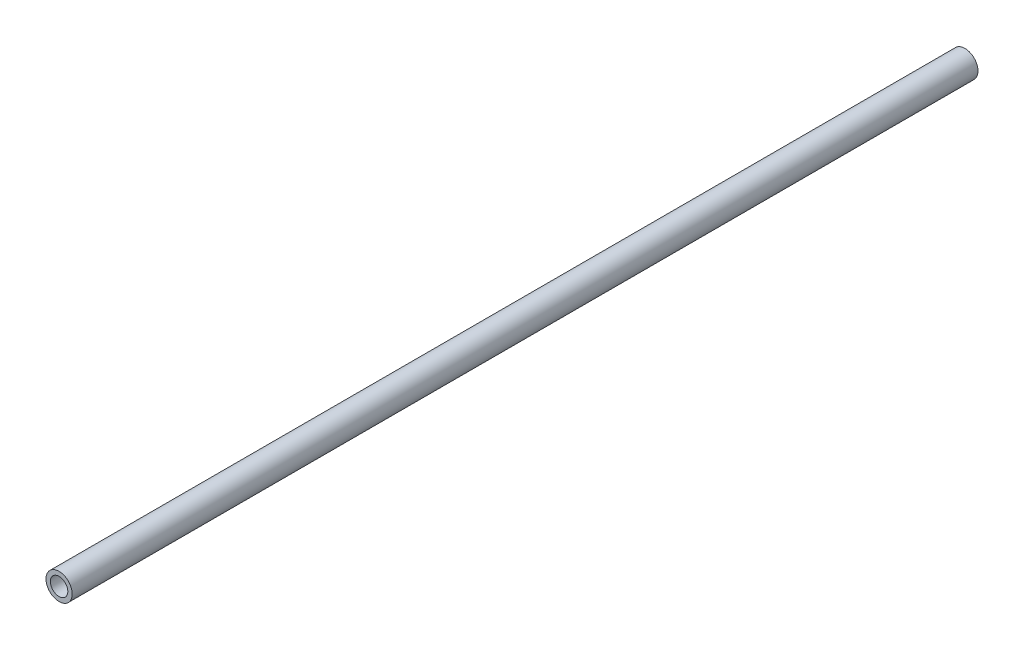
ISO-10303-21;
HEADER;
FILE_DESCRIPTION(('STEP AP214'),'2;1');
FILE_NAME('part.step','',(''),(''),'','','');
FILE_SCHEMA(('AUTOMOTIVE_DESIGN { 1 0 10303 214 1 1 1 1 }'));
ENDSEC;
DATA;
#1=APPLICATION_CONTEXT('core data for automotive mechanical design processes');
#2=APPLICATION_PROTOCOL_DEFINITION('international standard','automotive_design',2000,#1);
#3=PRODUCT_CONTEXT('',#1,'mechanical');
#4=PRODUCT('Part','Part','',(#3));
#5=PRODUCT_RELATED_PRODUCT_CATEGORY('part','',(#4));
#6=PRODUCT_DEFINITION_FORMATION('','',#4);
#7=PRODUCT_DEFINITION_CONTEXT('part definition',#1,'design');
#8=PRODUCT_DEFINITION('design','',#6,#7);
#9=PRODUCT_DEFINITION_SHAPE('','',#8);
#10=(LENGTH_UNIT() NAMED_UNIT(*) SI_UNIT(.MILLI.,.METRE.));
#11=(NAMED_UNIT(*) PLANE_ANGLE_UNIT() SI_UNIT($,.RADIAN.));
#12=(NAMED_UNIT(*) SI_UNIT($,.STERADIAN.) SOLID_ANGLE_UNIT());
#13=UNCERTAINTY_MEASURE_WITH_UNIT(LENGTH_MEASURE(1.E-05),#10,'distance_accuracy_value','');
#14=(GEOMETRIC_REPRESENTATION_CONTEXT(3) GLOBAL_UNCERTAINTY_ASSIGNED_CONTEXT((#13)) GLOBAL_UNIT_ASSIGNED_CONTEXT((#10,
#11,#12)) REPRESENTATION_CONTEXT('',''));
#15=CARTESIAN_POINT('',(0.,0.,0.));
#16=DIRECTION('',(0.,0.,1.));
#17=DIRECTION('',(1.,0.,0.));
#18=AXIS2_PLACEMENT_3D('',#15,#16,#17);
#19=CARTESIAN_POINT('',(0.,0.,207.5));
#20=DIRECTION('',(0.,0.,-1.));
#21=DIRECTION('',(-1.,0.,0.));
#22=AXIS2_PLACEMENT_3D('',#19,#20,#21);
#23=CYLINDRICAL_SURFACE('',#22,2.);
#24=CARTESIAN_POINT('',(0.,0.,207.5));
#25=DIRECTION('',(0.,0.,-1.));
#26=DIRECTION('',(1.,0.,0.));
#27=AXIS2_PLACEMENT_3D('',#24,#25,#26);
#28=CIRCLE('',#27,2.);
#29=CARTESIAN_POINT('',(2.,0.,207.5));
#30=VERTEX_POINT('',#29);
#31=EDGE_CURVE('E9',#30,#30,#28,.T.);
#32=ORIENTED_EDGE('',*,*,#31,.F.);
#33=EDGE_LOOP('',(#32));
#34=FACE_BOUND('',#33,.T.);
#35=CARTESIAN_POINT('',(0.,0.,0.));
#36=DIRECTION('',(0.,0.,-1.));
#37=DIRECTION('',(1.,0.,0.));
#38=AXIS2_PLACEMENT_3D('',#35,#36,#37);
#39=CIRCLE('',#38,2.);
#40=CARTESIAN_POINT('',(2.,0.,0.));
#41=VERTEX_POINT('',#40);
#42=EDGE_CURVE('E18',#41,#41,#39,.T.);
#43=ORIENTED_EDGE('',*,*,#42,.T.);
#44=EDGE_LOOP('',(#43));
#45=FACE_BOUND('',#44,.T.);
#46=ADVANCED_FACE('F14',(#34,#45),#23,.F.);
#47=CARTESIAN_POINT('',(0.,0.,207.5));
#48=DIRECTION('',(0.,0.,-1.));
#49=DIRECTION('',(-1.,0.,0.));
#50=AXIS2_PLACEMENT_3D('',#47,#48,#49);
#51=CYLINDRICAL_SURFACE('',#50,3.);
#52=CARTESIAN_POINT('',(0.,0.,207.5));
#53=DIRECTION('',(0.,0.,-1.));
#54=DIRECTION('',(1.,0.,0.));
#55=AXIS2_PLACEMENT_3D('',#52,#53,#54);
#56=CIRCLE('',#55,3.);
#57=CARTESIAN_POINT('',(3.,0.,207.5));
#58=VERTEX_POINT('',#57);
#59=EDGE_CURVE('E22',#58,#58,#56,.T.);
#60=ORIENTED_EDGE('',*,*,#59,.T.);
#61=EDGE_LOOP('',(#60));
#62=FACE_BOUND('',#61,.T.);
#63=CARTESIAN_POINT('',(0.,0.,0.));
#64=DIRECTION('',(0.,0.,-1.));
#65=DIRECTION('',(1.,0.,0.));
#66=AXIS2_PLACEMENT_3D('',#63,#64,#65);
#67=CIRCLE('',#66,3.);
#68=CARTESIAN_POINT('',(3.,0.,0.));
#69=VERTEX_POINT('',#68);
#70=EDGE_CURVE('E28',#69,#69,#67,.T.);
#71=ORIENTED_EDGE('',*,*,#70,.F.);
#72=EDGE_LOOP('',(#71));
#73=FACE_BOUND('',#72,.T.);
#74=ADVANCED_FACE('F16',(#62,#73),#51,.T.);
#75=CARTESIAN_POINT('',(0.,0.,207.5));
#76=DIRECTION('',(0.,0.,-1.));
#77=DIRECTION('',(-1.,0.,0.));
#78=AXIS2_PLACEMENT_3D('',#75,#76,#77);
#79=PLANE('',#78);
#80=ORIENTED_EDGE('',*,*,#31,.T.);
#81=EDGE_LOOP('',(#80));
#82=FACE_BOUND('',#81,.T.);
#83=ORIENTED_EDGE('',*,*,#59,.F.);
#84=EDGE_LOOP('',(#83));
#85=FACE_BOUND('',#84,.T.);
#86=ADVANCED_FACE('F43',(#82,#85),#79,.F.);
#87=CARTESIAN_POINT('',(0.,0.,0.));
#88=DIRECTION('',(0.,0.,-1.));
#89=DIRECTION('',(-1.,0.,0.));
#90=AXIS2_PLACEMENT_3D('',#87,#88,#89);
#91=PLANE('',#90);
#92=ORIENTED_EDGE('',*,*,#42,.F.);
#93=EDGE_LOOP('',(#92));
#94=FACE_BOUND('',#93,.T.);
#95=ORIENTED_EDGE('',*,*,#70,.T.);
#96=EDGE_LOOP('',(#95));
#97=FACE_BOUND('',#96,.T.);
#98=ADVANCED_FACE('F41',(#94,#97),#91,.T.);
#99=CLOSED_SHELL('',(#46,#74,#86,#98));
#100=MANIFOLD_SOLID_BREP('B1',#99);
#101=ADVANCED_BREP_SHAPE_REPRESENTATION('',(#18,#100),#14);
#102=SHAPE_DEFINITION_REPRESENTATION(#9,#101);
ENDSEC;
END-ISO-10303-21;
